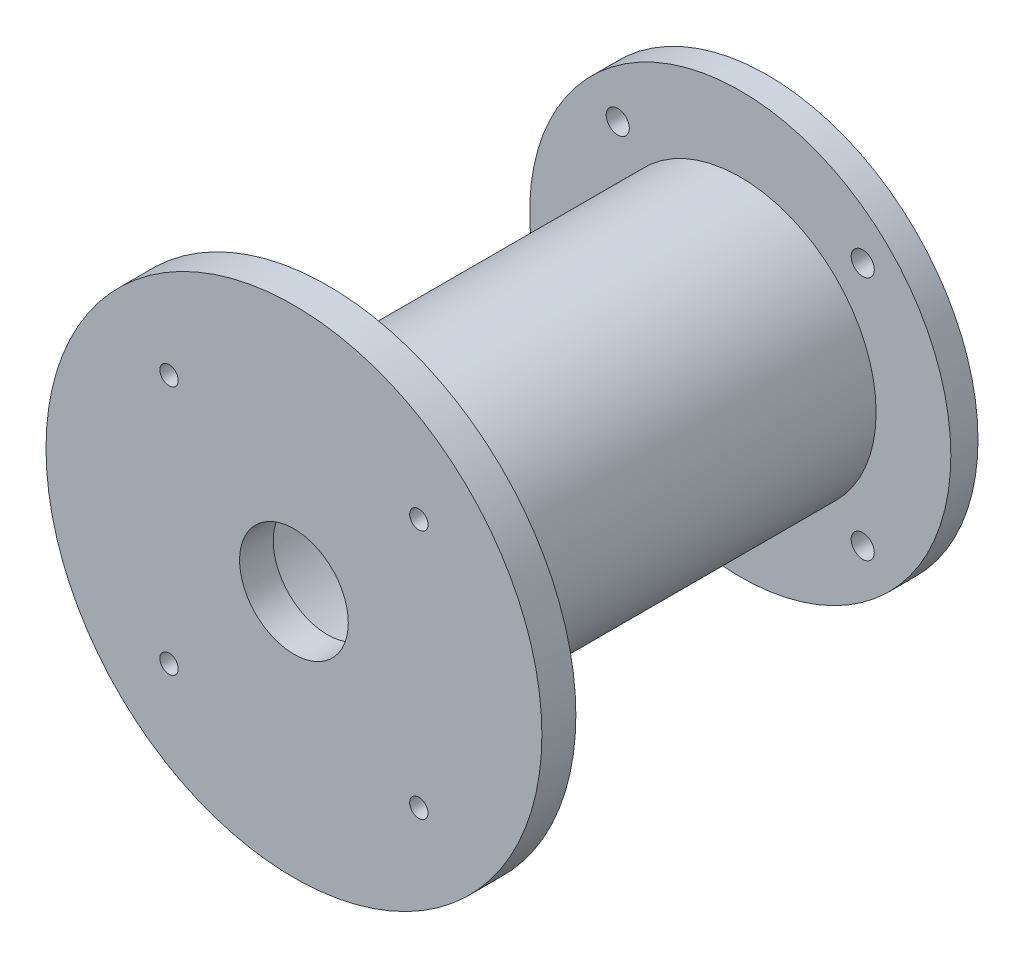
ISO-10303-21;
HEADER;
FILE_DESCRIPTION(('STEP AP214'),'2;1');
FILE_NAME('part.step','',(''),(''),'','','');
FILE_SCHEMA(('AUTOMOTIVE_DESIGN { 1 0 10303 214 1 1 1 1 }'));
ENDSEC;
DATA;
#1=APPLICATION_CONTEXT('core data for automotive mechanical design processes');
#2=APPLICATION_PROTOCOL_DEFINITION('international standard','automotive_design',2000,#1);
#3=PRODUCT_CONTEXT('',#1,'mechanical');
#4=PRODUCT('Part','Part','',(#3));
#5=PRODUCT_RELATED_PRODUCT_CATEGORY('part','',(#4));
#6=PRODUCT_DEFINITION_FORMATION('','',#4);
#7=PRODUCT_DEFINITION_CONTEXT('part definition',#1,'design');
#8=PRODUCT_DEFINITION('design','',#6,#7);
#9=PRODUCT_DEFINITION_SHAPE('','',#8);
#10=(LENGTH_UNIT() NAMED_UNIT(*) SI_UNIT(.MILLI.,.METRE.));
#11=(NAMED_UNIT(*) PLANE_ANGLE_UNIT() SI_UNIT($,.RADIAN.));
#12=(NAMED_UNIT(*) SI_UNIT($,.STERADIAN.) SOLID_ANGLE_UNIT());
#13=UNCERTAINTY_MEASURE_WITH_UNIT(LENGTH_MEASURE(1.E-05),#10,'distance_accuracy_value','');
#14=(GEOMETRIC_REPRESENTATION_CONTEXT(3) GLOBAL_UNCERTAINTY_ASSIGNED_CONTEXT((#13)) GLOBAL_UNIT_ASSIGNED_CONTEXT((#10,
#11,#12)) REPRESENTATION_CONTEXT('',''));
#15=CARTESIAN_POINT('',(0.,0.,0.));
#16=DIRECTION('',(0.,0.,1.));
#17=DIRECTION('',(1.,0.,0.));
#18=AXIS2_PLACEMENT_3D('',#15,#16,#17);
#19=CARTESIAN_POINT('',(120.,0.,131.7));
#20=DIRECTION('',(0.,0.,1.));
#21=DIRECTION('',(1.,0.,0.));
#22=AXIS2_PLACEMENT_3D('',#19,#20,#21);
#23=PLANE('',#22);
#24=CARTESIAN_POINT('',(138.38477631085,18.38477631085,131.7));
#25=DIRECTION('',(0.,0.,1.));
#26=DIRECTION('',(1.,0.,0.));
#27=AXIS2_PLACEMENT_3D('',#24,#25,#26);
#28=CIRCLE('',#27,1.35);
#29=CARTESIAN_POINT('',(139.73477631085,18.38477631085,131.7));
#30=VERTEX_POINT('',#29);
#31=EDGE_CURVE('E279',#30,#30,#28,.T.);
#32=ORIENTED_EDGE('',*,*,#31,.F.);
#33=EDGE_LOOP('',(#32));
#34=FACE_BOUND('',#33,.T.);
#35=CARTESIAN_POINT('',(101.61522368915,18.38477631085,131.7));
#36=DIRECTION('',(0.,0.,1.));
#37=DIRECTION('',(1.,0.,0.));
#38=AXIS2_PLACEMENT_3D('',#35,#36,#37);
#39=CIRCLE('',#38,1.35);
#40=CARTESIAN_POINT('',(102.96522368915,18.38477631085,131.7));
#41=VERTEX_POINT('',#40);
#42=EDGE_CURVE('E316',#41,#41,#39,.T.);
#43=ORIENTED_EDGE('',*,*,#42,.F.);
#44=EDGE_LOOP('',(#43));
#45=FACE_BOUND('',#44,.T.);
#46=CARTESIAN_POINT('',(120.,0.,131.7));
#47=DIRECTION('',(0.,0.,1.));
#48=DIRECTION('',(1.,0.,0.));
#49=AXIS2_PLACEMENT_3D('',#46,#47,#48);
#50=CIRCLE('',#49,8.);
#51=CARTESIAN_POINT('',(128.,0.,131.7));
#52=VERTEX_POINT('',#51);
#53=EDGE_CURVE('E9',#52,#52,#50,.T.);
#54=ORIENTED_EDGE('',*,*,#53,.F.);
#55=EDGE_LOOP('',(#54));
#56=FACE_BOUND('',#55,.T.);
#57=CARTESIAN_POINT('',(138.38477631085,-18.38477631085,131.7));
#58=DIRECTION('',(0.,0.,1.));
#59=DIRECTION('',(1.,0.,0.));
#60=AXIS2_PLACEMENT_3D('',#57,#58,#59);
#61=CIRCLE('',#60,1.35);
#62=CARTESIAN_POINT('',(139.73477631085,-18.38477631085,131.7));
#63=VERTEX_POINT('',#62);
#64=EDGE_CURVE('E211',#63,#63,#61,.T.);
#65=ORIENTED_EDGE('',*,*,#64,.F.);
#66=EDGE_LOOP('',(#65));
#67=FACE_BOUND('',#66,.T.);
#68=CARTESIAN_POINT('',(101.61522368915,-18.38477631085,131.7));
#69=DIRECTION('',(0.,0.,1.));
#70=DIRECTION('',(1.,0.,0.));
#71=AXIS2_PLACEMENT_3D('',#68,#69,#70);
#72=CIRCLE('',#71,1.35);
#73=CARTESIAN_POINT('',(102.96522368915,-18.38477631085,131.7));
#74=VERTEX_POINT('',#73);
#75=EDGE_CURVE('E212',#74,#74,#72,.T.);
#76=ORIENTED_EDGE('',*,*,#75,.F.);
#77=EDGE_LOOP('',(#76));
#78=FACE_BOUND('',#77,.T.);
#79=CARTESIAN_POINT('',(120.,0.,131.7));
#80=DIRECTION('',(0.,0.,1.));
#81=DIRECTION('',(1.,0.,0.));
#82=AXIS2_PLACEMENT_3D('',#79,#80,#81);
#83=CIRCLE('',#82,36.5);
#84=CARTESIAN_POINT('',(156.5,0.,131.7));
#85=VERTEX_POINT('',#84);
#86=EDGE_CURVE('E273',#85,#85,#83,.T.);
#87=ORIENTED_EDGE('',*,*,#86,.T.);
#88=EDGE_LOOP('',(#87));
#89=FACE_BOUND('',#88,.T.);
#90=ADVANCED_FACE('F14',(#34,#45,#56,#67,#78,#89),#23,.T.);
#91=CARTESIAN_POINT('',(120.,0.,126.6));
#92=DIRECTION('',(0.,0.,1.));
#93=DIRECTION('',(1.,0.,0.));
#94=AXIS2_PLACEMENT_3D('',#91,#92,#93);
#95=CYLINDRICAL_SURFACE('',#94,8.);
#96=DIRECTION('',(0.,0.,1.));
#97=VECTOR('',#96,1.);
#98=CARTESIAN_POINT('',(128.,0.,126.6));
#99=LINE('',#98,#97);
#100=CARTESIAN_POINT('',(128.,0.,126.75));
#101=VERTEX_POINT('',#100);
#102=EDGE_CURVE('E25',#101,#52,#99,.T.);
#103=ORIENTED_EDGE('',*,*,#102,.F.);
#104=CARTESIAN_POINT('',(120.,0.,126.75));
#105=DIRECTION('',(0.,0.,1.));
#106=DIRECTION('',(1.,0.,0.));
#107=AXIS2_PLACEMENT_3D('',#104,#105,#106);
#108=CIRCLE('',#107,8.);
#109=EDGE_CURVE('E261',#101,#101,#108,.T.);
#110=ORIENTED_EDGE('',*,*,#109,.F.);
#111=ORIENTED_EDGE('',*,*,#102,.T.);
#112=ORIENTED_EDGE('',*,*,#53,.T.);
#113=EDGE_LOOP('',(#103,#110,#111,#112));
#114=FACE_BOUND('',#113,.T.);
#115=ADVANCED_FACE('F383',(#114),#95,.F.);
#116=CARTESIAN_POINT('',(138.38477631085,18.38477631085,126.6));
#117=DIRECTION('',(0.,0.,1.));
#118=DIRECTION('',(1.,0.,0.));
#119=AXIS2_PLACEMENT_3D('',#116,#117,#118);
#120=CYLINDRICAL_SURFACE('',#119,1.35);
#121=DIRECTION('',(0.,0.,1.));
#122=VECTOR('',#121,1.);
#123=CARTESIAN_POINT('',(139.73477631085,18.38477631085,126.6));
#124=LINE('',#123,#122);
#125=CARTESIAN_POINT('',(139.73477631085,18.38477631085,126.7));
#126=VERTEX_POINT('',#125);
#127=EDGE_CURVE('E312',#126,#30,#124,.T.);
#128=ORIENTED_EDGE('',*,*,#127,.F.);
#129=CARTESIAN_POINT('',(138.38477631085,18.38477631085,126.7));
#130=DIRECTION('',(0.,0.,1.));
#131=DIRECTION('',(1.,0.,0.));
#132=AXIS2_PLACEMENT_3D('',#129,#130,#131);
#133=CIRCLE('',#132,1.35);
#134=EDGE_CURVE('E207',#126,#126,#133,.T.);
#135=ORIENTED_EDGE('',*,*,#134,.F.);
#136=ORIENTED_EDGE('',*,*,#127,.T.);
#137=ORIENTED_EDGE('',*,*,#31,.T.);
#138=EDGE_LOOP('',(#128,#135,#136,#137));
#139=FACE_BOUND('',#138,.T.);
#140=ADVANCED_FACE('F433',(#139),#120,.F.);
#141=CARTESIAN_POINT('',(101.61522368915,18.38477631085,126.6));
#142=DIRECTION('',(0.,0.,1.));
#143=DIRECTION('',(1.,0.,0.));
#144=AXIS2_PLACEMENT_3D('',#141,#142,#143);
#145=CYLINDRICAL_SURFACE('',#144,1.35);
#146=DIRECTION('',(0.,0.,1.));
#147=VECTOR('',#146,1.);
#148=CARTESIAN_POINT('',(102.96522368915,18.38477631085,126.6));
#149=LINE('',#148,#147);
#150=CARTESIAN_POINT('',(102.96522368915,18.38477631085,126.7));
#151=VERTEX_POINT('',#150);
#152=EDGE_CURVE('E103',#151,#41,#149,.T.);
#153=ORIENTED_EDGE('',*,*,#152,.F.);
#154=CARTESIAN_POINT('',(101.61522368915,18.38477631085,126.7));
#155=DIRECTION('',(0.,0.,1.));
#156=DIRECTION('',(1.,0.,0.));
#157=AXIS2_PLACEMENT_3D('',#154,#155,#156);
#158=CIRCLE('',#157,1.35);
#159=EDGE_CURVE('E256',#151,#151,#158,.T.);
#160=ORIENTED_EDGE('',*,*,#159,.F.);
#161=ORIENTED_EDGE('',*,*,#152,.T.);
#162=ORIENTED_EDGE('',*,*,#42,.T.);
#163=EDGE_LOOP('',(#153,#160,#161,#162));
#164=FACE_BOUND('',#163,.T.);
#165=ADVANCED_FACE('F423',(#164),#145,.F.);
#166=CARTESIAN_POINT('',(138.38477631085,-18.38477631085,126.6));
#167=DIRECTION('',(0.,0.,1.));
#168=DIRECTION('',(1.,0.,0.));
#169=AXIS2_PLACEMENT_3D('',#166,#167,#168);
#170=CYLINDRICAL_SURFACE('',#169,1.35);
#171=DIRECTION('',(0.,0.,1.));
#172=VECTOR('',#171,1.);
#173=CARTESIAN_POINT('',(139.73477631085,-18.38477631085,126.6));
#174=LINE('',#173,#172);
#175=CARTESIAN_POINT('',(139.73477631085,-18.38477631085,126.7));
#176=VERTEX_POINT('',#175);
#177=EDGE_CURVE('E114',#176,#63,#174,.T.);
#178=ORIENTED_EDGE('',*,*,#177,.F.);
#179=CARTESIAN_POINT('',(138.38477631085,-18.38477631085,126.7));
#180=DIRECTION('',(0.,0.,1.));
#181=DIRECTION('',(1.,0.,0.));
#182=AXIS2_PLACEMENT_3D('',#179,#180,#181);
#183=CIRCLE('',#182,1.35);
#184=EDGE_CURVE('E297',#176,#176,#183,.T.);
#185=ORIENTED_EDGE('',*,*,#184,.F.);
#186=ORIENTED_EDGE('',*,*,#177,.T.);
#187=ORIENTED_EDGE('',*,*,#64,.T.);
#188=EDGE_LOOP('',(#178,#185,#186,#187));
#189=FACE_BOUND('',#188,.T.);
#190=ADVANCED_FACE('F420',(#189),#170,.F.);
#191=CARTESIAN_POINT('',(101.61522368915,-18.38477631085,126.6));
#192=DIRECTION('',(0.,0.,1.));
#193=DIRECTION('',(1.,0.,0.));
#194=AXIS2_PLACEMENT_3D('',#191,#192,#193);
#195=CYLINDRICAL_SURFACE('',#194,1.35);
#196=DIRECTION('',(0.,0.,1.));
#197=VECTOR('',#196,1.);
#198=CARTESIAN_POINT('',(102.96522368915,-18.38477631085,126.6));
#199=LINE('',#198,#197);
#200=CARTESIAN_POINT('',(102.96522368915,-18.38477631085,126.7));
#201=VERTEX_POINT('',#200);
#202=EDGE_CURVE('E272',#201,#74,#199,.T.);
#203=ORIENTED_EDGE('',*,*,#202,.F.);
#204=CARTESIAN_POINT('',(101.61522368915,-18.38477631085,126.7));
#205=DIRECTION('',(0.,0.,1.));
#206=DIRECTION('',(1.,0.,0.));
#207=AXIS2_PLACEMENT_3D('',#204,#205,#206);
#208=CIRCLE('',#207,1.35);
#209=EDGE_CURVE('E300',#201,#201,#208,.T.);
#210=ORIENTED_EDGE('',*,*,#209,.F.);
#211=ORIENTED_EDGE('',*,*,#202,.T.);
#212=ORIENTED_EDGE('',*,*,#75,.T.);
#213=EDGE_LOOP('',(#203,#210,#211,#212));
#214=FACE_BOUND('',#213,.T.);
#215=ADVANCED_FACE('F378',(#214),#195,.F.);
#216=CARTESIAN_POINT('',(120.,0.,126.7));
#217=DIRECTION('',(0.,0.,1.));
#218=DIRECTION('',(1.,0.,0.));
#219=AXIS2_PLACEMENT_3D('',#216,#217,#218);
#220=CYLINDRICAL_SURFACE('',#219,36.5);
#221=ORIENTED_EDGE('',*,*,#86,.F.);
#222=DIRECTION('',(0.,0.,1.));
#223=VECTOR('',#222,1.);
#224=CARTESIAN_POINT('',(156.5,0.,126.7));
#225=LINE('',#224,#223);
#226=CARTESIAN_POINT('',(156.5,0.,126.7));
#227=VERTEX_POINT('',#226);
#228=EDGE_CURVE('E269',#227,#85,#225,.T.);
#229=ORIENTED_EDGE('',*,*,#228,.F.);
#230=CARTESIAN_POINT('',(120.,0.,126.7));
#231=DIRECTION('',(0.,0.,1.));
#232=DIRECTION('',(1.,0.,0.));
#233=AXIS2_PLACEMENT_3D('',#230,#231,#232);
#234=CIRCLE('',#233,36.5);
#235=EDGE_CURVE('E317',#227,#227,#234,.T.);
#236=ORIENTED_EDGE('',*,*,#235,.T.);
#237=ORIENTED_EDGE('',*,*,#228,.T.);
#238=EDGE_LOOP('',(#221,#229,#236,#237));
#239=FACE_BOUND('',#238,.T.);
#240=ADVANCED_FACE('F388',(#239),#220,.T.);
#241=CARTESIAN_POINT('',(104.,-6.,101.7));
#242=DIRECTION('',(1.,0.,0.));
#243=DIRECTION('',(0.,1.,0.));
#244=AXIS2_PLACEMENT_3D('',#241,#242,#243);
#245=PLANE('',#244);
#246=DIRECTION('',(0.,0.,1.));
#247=VECTOR('',#246,1.);
#248=CARTESIAN_POINT('',(104.,6.,101.7));
#249=LINE('',#248,#247);
#250=CARTESIAN_POINT('',(104.,6.,101.7));
#251=VERTEX_POINT('',#250);
#252=CARTESIAN_POINT('',(104.,6.,126.7));
#253=VERTEX_POINT('',#252);
#254=EDGE_CURVE('E287',#251,#253,#249,.T.);
#255=ORIENTED_EDGE('',*,*,#254,.F.);
#256=DIRECTION('',(0.,1.,0.));
#257=VECTOR('',#256,1.);
#258=CARTESIAN_POINT('',(104.,-6.,101.7));
#259=LINE('',#258,#257);
#260=CARTESIAN_POINT('',(104.,5.744562646538,101.7));
#261=VERTEX_POINT('',#260);
#262=EDGE_CURVE('E262',#261,#251,#259,.T.);
#263=ORIENTED_EDGE('',*,*,#262,.F.);
#264=DIRECTION('',(0.,0.,1.));
#265=VECTOR('',#264,1.);
#266=CARTESIAN_POINT('',(104.,5.744562646538,61.95));
#267=LINE('',#266,#265);
#268=CARTESIAN_POINT('',(104.,5.744562646538,126.7));
#269=VERTEX_POINT('',#268);
#270=EDGE_CURVE('E224',#261,#269,#267,.T.);
#271=ORIENTED_EDGE('',*,*,#270,.T.);
#272=DIRECTION('',(0.,1.,0.));
#273=VECTOR('',#272,1.);
#274=CARTESIAN_POINT('',(104.,-6.,126.7));
#275=LINE('',#274,#273);
#276=EDGE_CURVE('E229',#269,#253,#275,.T.);
#277=ORIENTED_EDGE('',*,*,#276,.T.);
#278=EDGE_LOOP('',(#255,#263,#271,#277));
#279=FACE_BOUND('',#278,.T.);
#280=ADVANCED_FACE('F413',(#279),#245,.F.);
#281=CARTESIAN_POINT('',(104.,-6.,101.7));
#282=DIRECTION('',(1.,0.,0.));
#283=DIRECTION('',(0.,1.,0.));
#284=AXIS2_PLACEMENT_3D('',#281,#282,#283);
#285=PLANE('',#284);
#286=DIRECTION('',(0.,0.,1.));
#287=VECTOR('',#286,1.);
#288=CARTESIAN_POINT('',(104.,-5.744562646538,61.95));
#289=LINE('',#288,#287);
#290=CARTESIAN_POINT('',(104.,-5.744562646538,101.7));
#291=VERTEX_POINT('',#290);
#292=CARTESIAN_POINT('',(104.,-5.744562646538,126.7));
#293=VERTEX_POINT('',#292);
#294=EDGE_CURVE('E223',#291,#293,#289,.T.);
#295=ORIENTED_EDGE('',*,*,#294,.F.);
#296=DIRECTION('',(0.,1.,0.));
#297=VECTOR('',#296,1.);
#298=CARTESIAN_POINT('',(104.,-6.,101.7));
#299=LINE('',#298,#297);
#300=CARTESIAN_POINT('',(104.,-6.,101.7));
#301=VERTEX_POINT('',#300);
#302=EDGE_CURVE('E217',#301,#291,#299,.T.);
#303=ORIENTED_EDGE('',*,*,#302,.F.);
#304=DIRECTION('',(0.,0.,1.));
#305=VECTOR('',#304,1.);
#306=CARTESIAN_POINT('',(104.,-6.,101.7));
#307=LINE('',#306,#305);
#308=CARTESIAN_POINT('',(104.,-6.,126.7));
#309=VERTEX_POINT('',#308);
#310=EDGE_CURVE('E257',#301,#309,#307,.T.);
#311=ORIENTED_EDGE('',*,*,#310,.T.);
#312=DIRECTION('',(0.,1.,0.));
#313=VECTOR('',#312,1.);
#314=CARTESIAN_POINT('',(104.,-6.,126.7));
#315=LINE('',#314,#313);
#316=EDGE_CURVE('E208',#309,#293,#315,.T.);
#317=ORIENTED_EDGE('',*,*,#316,.T.);
#318=EDGE_LOOP('',(#295,#303,#311,#317));
#319=FACE_BOUND('',#318,.T.);
#320=ADVANCED_FACE('F16',(#319),#285,.F.);
#321=CARTESIAN_POINT('',(120.,0.,126.75));
#322=DIRECTION('',(0.,0.,1.));
#323=DIRECTION('',(1.,0.,0.));
#324=AXIS2_PLACEMENT_3D('',#321,#322,#323);
#325=PLANE('',#324);
#326=ORIENTED_EDGE('',*,*,#109,.T.);
#327=EDGE_LOOP('',(#326));
#328=FACE_BOUND('',#327,.T.);
#329=CARTESIAN_POINT('',(120.,0.,126.75));
#330=DIRECTION('',(0.,0.,1.));
#331=DIRECTION('',(1.,0.,0.));
#332=AXIS2_PLACEMENT_3D('',#329,#330,#331);
#333=CIRCLE('',#332,17.);
#334=CARTESIAN_POINT('',(137.,0.,126.75));
#335=VERTEX_POINT('',#334);
#336=EDGE_CURVE('E194',#335,#335,#333,.T.);
#337=ORIENTED_EDGE('',*,*,#336,.F.);
#338=EDGE_LOOP('',(#337));
#339=FACE_BOUND('',#338,.T.);
#340=ADVANCED_FACE('F428',(#328,#339),#325,.F.);
#341=CARTESIAN_POINT('',(99.,-6.,101.7));
#342=DIRECTION('',(0.,1.,0.));
#343=DIRECTION('',(1.,0.,0.));
#344=AXIS2_PLACEMENT_3D('',#341,#342,#343);
#345=PLANE('',#344);
#346=DIRECTION('',(1.,0.,0.));
#347=VECTOR('',#346,1.);
#348=CARTESIAN_POINT('',(99.,-6.,101.7));
#349=LINE('',#348,#347);
#350=CARTESIAN_POINT('',(100.92121597166,-6.,101.7));
#351=VERTEX_POINT('',#350);
#352=EDGE_CURVE('E213',#351,#301,#349,.T.);
#353=ORIENTED_EDGE('',*,*,#352,.F.);
#354=DIRECTION('',(0.,0.,1.));
#355=VECTOR('',#354,1.);
#356=CARTESIAN_POINT('',(100.92121597166,-6.,62.));
#357=LINE('',#356,#355);
#358=CARTESIAN_POINT('',(100.92121597166,-6.,126.7));
#359=VERTEX_POINT('',#358);
#360=EDGE_CURVE('E202',#351,#359,#357,.T.);
#361=ORIENTED_EDGE('',*,*,#360,.T.);
#362=DIRECTION('',(1.,0.,0.));
#363=VECTOR('',#362,1.);
#364=CARTESIAN_POINT('',(99.,-6.,126.7));
#365=LINE('',#364,#363);
#366=EDGE_CURVE('E204',#359,#309,#365,.T.);
#367=ORIENTED_EDGE('',*,*,#366,.T.);
#368=ORIENTED_EDGE('',*,*,#310,.F.);
#369=EDGE_LOOP('',(#353,#361,#367,#368));
#370=FACE_BOUND('',#369,.T.);
#371=ADVANCED_FACE('F426',(#370),#345,.T.);
#372=CARTESIAN_POINT('',(99.,-6.,101.7));
#373=DIRECTION('',(0.,0.,1.));
#374=DIRECTION('',(1.,0.,0.));
#375=AXIS2_PLACEMENT_3D('',#372,#373,#374);
#376=PLANE('',#375);
#377=DIRECTION('',(1.,0.,0.));
#378=VECTOR('',#377,1.);
#379=CARTESIAN_POINT('',(99.,6.,101.7));
#380=LINE('',#379,#378);
#381=CARTESIAN_POINT('',(100.92121597166,6.,101.7));
#382=VERTEX_POINT('',#381);
#383=EDGE_CURVE('E218',#382,#251,#380,.T.);
#384=ORIENTED_EDGE('',*,*,#383,.F.);
#385=CARTESIAN_POINT('',(120.,0.,101.7));
#386=DIRECTION('',(0.,0.,1.));
#387=DIRECTION('',(1.,0.,0.));
#388=AXIS2_PLACEMENT_3D('',#385,#386,#387);
#389=CIRCLE('',#388,20.);
#390=EDGE_CURVE('E243',#382,#351,#389,.T.);
#391=ORIENTED_EDGE('',*,*,#390,.T.);
#392=ORIENTED_EDGE('',*,*,#352,.T.);
#393=ORIENTED_EDGE('',*,*,#302,.T.);
#394=CARTESIAN_POINT('',(120.,0.,101.7));
#395=DIRECTION('',(0.,0.,1.));
#396=DIRECTION('',(1.,0.,0.));
#397=AXIS2_PLACEMENT_3D('',#394,#395,#396);
#398=CIRCLE('',#397,17.);
#399=EDGE_CURVE('E219',#261,#291,#398,.T.);
#400=ORIENTED_EDGE('',*,*,#399,.F.);
#401=ORIENTED_EDGE('',*,*,#262,.T.);
#402=EDGE_LOOP('',(#384,#391,#392,#393,#400,#401));
#403=FACE_BOUND('',#402,.T.);
#404=ADVANCED_FACE('F404',(#403),#376,.T.);
#405=CARTESIAN_POINT('',(99.,6.,101.7));
#406=DIRECTION('',(0.,1.,0.));
#407=DIRECTION('',(1.,0.,0.));
#408=AXIS2_PLACEMENT_3D('',#405,#406,#407);
#409=PLANE('',#408);
#410=ORIENTED_EDGE('',*,*,#254,.T.);
#411=DIRECTION('',(1.,0.,0.));
#412=VECTOR('',#411,1.);
#413=CARTESIAN_POINT('',(99.,6.,126.7));
#414=LINE('',#413,#412);
#415=CARTESIAN_POINT('',(100.92121597166,6.,126.7));
#416=VERTEX_POINT('',#415);
#417=EDGE_CURVE('E233',#416,#253,#414,.T.);
#418=ORIENTED_EDGE('',*,*,#417,.F.);
#419=DIRECTION('',(0.,0.,1.));
#420=VECTOR('',#419,1.);
#421=CARTESIAN_POINT('',(100.92121597166,6.,62.));
#422=LINE('',#421,#420);
#423=EDGE_CURVE('E198',#382,#416,#422,.T.);
#424=ORIENTED_EDGE('',*,*,#423,.F.);
#425=ORIENTED_EDGE('',*,*,#383,.T.);
#426=EDGE_LOOP('',(#410,#418,#424,#425));
#427=FACE_BOUND('',#426,.T.);
#428=ADVANCED_FACE('F394',(#427),#409,.F.);
#429=CARTESIAN_POINT('',(120.,0.,126.7));
#430=DIRECTION('',(0.,0.,1.));
#431=DIRECTION('',(1.,0.,0.));
#432=AXIS2_PLACEMENT_3D('',#429,#430,#431);
#433=PLANE('',#432);
#434=ORIENTED_EDGE('',*,*,#134,.T.);
#435=EDGE_LOOP('',(#434));
#436=FACE_BOUND('',#435,.T.);
#437=ORIENTED_EDGE('',*,*,#417,.T.);
#438=ORIENTED_EDGE('',*,*,#276,.F.);
#439=CARTESIAN_POINT('',(120.,0.,126.7));
#440=DIRECTION('',(0.,0.,1.));
#441=DIRECTION('',(1.,0.,0.));
#442=AXIS2_PLACEMENT_3D('',#439,#440,#441);
#443=CIRCLE('',#442,17.);
#444=EDGE_CURVE('E228',#269,#293,#443,.T.);
#445=ORIENTED_EDGE('',*,*,#444,.T.);
#446=ORIENTED_EDGE('',*,*,#316,.F.);
#447=ORIENTED_EDGE('',*,*,#366,.F.);
#448=CARTESIAN_POINT('',(120.,0.,126.7));
#449=DIRECTION('',(0.,0.,1.));
#450=DIRECTION('',(1.,0.,0.));
#451=AXIS2_PLACEMENT_3D('',#448,#449,#450);
#452=CIRCLE('',#451,20.);
#453=CARTESIAN_POINT('',(140.,0.,126.7));
#454=VERTEX_POINT('',#453);
#455=EDGE_CURVE('E234',#359,#454,#452,.T.);
#456=ORIENTED_EDGE('',*,*,#455,.T.);
#457=CARTESIAN_POINT('',(120.,0.,126.7));
#458=DIRECTION('',(0.,0.,1.));
#459=DIRECTION('',(1.,0.,0.));
#460=AXIS2_PLACEMENT_3D('',#457,#458,#459);
#461=CIRCLE('',#460,20.);
#462=EDGE_CURVE('E187',#454,#416,#461,.T.);
#463=ORIENTED_EDGE('',*,*,#462,.T.);
#464=EDGE_LOOP('',(#437,#438,#445,#446,#447,#456,#463));
#465=FACE_BOUND('',#464,.T.);
#466=ORIENTED_EDGE('',*,*,#159,.T.);
#467=EDGE_LOOP('',(#466));
#468=FACE_BOUND('',#467,.T.);
#469=ORIENTED_EDGE('',*,*,#184,.T.);
#470=EDGE_LOOP('',(#469));
#471=FACE_BOUND('',#470,.T.);
#472=ORIENTED_EDGE('',*,*,#209,.T.);
#473=EDGE_LOOP('',(#472));
#474=FACE_BOUND('',#473,.T.);
#475=ORIENTED_EDGE('',*,*,#235,.F.);
#476=EDGE_LOOP('',(#475));
#477=FACE_BOUND('',#476,.T.);
#478=ADVANCED_FACE('F391',(#436,#465,#468,#471,#474,#477),#433,.F.);
#479=CARTESIAN_POINT('',(120.,0.,61.95));
#480=DIRECTION('',(0.,0.,1.));
#481=DIRECTION('',(1.,0.,0.));
#482=AXIS2_PLACEMENT_3D('',#479,#480,#481);
#483=CYLINDRICAL_SURFACE('',#482,17.);
#484=ORIENTED_EDGE('',*,*,#444,.F.);
#485=ORIENTED_EDGE('',*,*,#270,.F.);
#486=ORIENTED_EDGE('',*,*,#399,.T.);
#487=ORIENTED_EDGE('',*,*,#294,.T.);
#488=EDGE_LOOP('',(#484,#485,#486,#487));
#489=FACE_BOUND('',#488,.T.);
#490=DIRECTION('',(0.,0.,1.));
#491=VECTOR('',#490,1.);
#492=CARTESIAN_POINT('',(137.,0.,61.95));
#493=LINE('',#492,#491);
#494=CARTESIAN_POINT('',(137.,0.,62.));
#495=VERTEX_POINT('',#494);
#496=EDGE_CURVE('E186',#495,#335,#493,.T.);
#497=ORIENTED_EDGE('',*,*,#496,.T.);
#498=ORIENTED_EDGE('',*,*,#336,.T.);
#499=ORIENTED_EDGE('',*,*,#496,.F.);
#500=CARTESIAN_POINT('',(120.,0.,62.));
#501=DIRECTION('',(0.,0.,1.));
#502=DIRECTION('',(1.,0.,0.));
#503=AXIS2_PLACEMENT_3D('',#500,#501,#502);
#504=CIRCLE('',#503,17.);
#505=EDGE_CURVE('E242',#495,#495,#504,.T.);
#506=ORIENTED_EDGE('',*,*,#505,.F.);
#507=EDGE_LOOP('',(#497,#498,#499,#506));
#508=FACE_BOUND('',#507,.T.);
#509=ADVANCED_FACE('F393',(#489,#508),#483,.F.);
#510=CARTESIAN_POINT('',(138.03122292025,18.031222920257,61.9));
#511=DIRECTION('',(0.,0.,1.));
#512=DIRECTION('',(1.,0.,0.));
#513=AXIS2_PLACEMENT_3D('',#510,#511,#512);
#514=CYLINDRICAL_SURFACE('',#513,1.7);
#515=DIRECTION('',(0.,0.,1.));
#516=VECTOR('',#515,1.);
#517=CARTESIAN_POINT('',(139.73122292025,18.031222920257,61.9));
#518=LINE('',#517,#516);
#519=CARTESIAN_POINT('',(139.73122292025,18.031222920257,62.));
#520=VERTEX_POINT('',#519);
#521=CARTESIAN_POINT('',(139.73122292025,18.031222920257,66.));
#522=VERTEX_POINT('',#521);
#523=EDGE_CURVE('E179',#520,#522,#518,.T.);
#524=ORIENTED_EDGE('',*,*,#523,.F.);
#525=CARTESIAN_POINT('',(138.03122292025,18.031222920257,62.));
#526=DIRECTION('',(0.,0.,1.));
#527=DIRECTION('',(1.,0.,0.));
#528=AXIS2_PLACEMENT_3D('',#525,#526,#527);
#529=CIRCLE('',#528,1.7);
#530=EDGE_CURVE('E184',#520,#520,#529,.T.);
#531=ORIENTED_EDGE('',*,*,#530,.F.);
#532=ORIENTED_EDGE('',*,*,#523,.T.);
#533=CARTESIAN_POINT('',(138.03122292025,18.031222920257,66.));
#534=DIRECTION('',(0.,0.,1.));
#535=DIRECTION('',(1.,0.,0.));
#536=AXIS2_PLACEMENT_3D('',#533,#534,#535);
#537=CIRCLE('',#536,1.7);
#538=EDGE_CURVE('E182',#522,#522,#537,.T.);
#539=ORIENTED_EDGE('',*,*,#538,.T.);
#540=EDGE_LOOP('',(#524,#531,#532,#539));
#541=FACE_BOUND('',#540,.T.);
#542=ADVANCED_FACE('F180',(#541),#514,.F.);
#543=CARTESIAN_POINT('',(120.,0.,62.));
#544=DIRECTION('',(0.,0.,1.));
#545=DIRECTION('',(1.,0.,0.));
#546=AXIS2_PLACEMENT_3D('',#543,#544,#545);
#547=CYLINDRICAL_SURFACE('',#546,20.);
#548=DIRECTION('',(0.,0.,1.));
#549=VECTOR('',#548,1.);
#550=CARTESIAN_POINT('',(140.,0.,62.));
#551=LINE('',#550,#549);
#552=CARTESIAN_POINT('',(140.,0.,66.));
#553=VERTEX_POINT('',#552);
#554=EDGE_CURVE('E238',#553,#454,#551,.T.);
#555=ORIENTED_EDGE('',*,*,#554,.F.);
#556=CARTESIAN_POINT('',(120.,0.,66.));
#557=DIRECTION('',(0.,0.,1.));
#558=DIRECTION('',(1.,0.,0.));
#559=AXIS2_PLACEMENT_3D('',#556,#557,#558);
#560=CIRCLE('',#559,20.);
#561=EDGE_CURVE('E293',#553,#553,#560,.T.);
#562=ORIENTED_EDGE('',*,*,#561,.T.);
#563=ORIENTED_EDGE('',*,*,#554,.T.);
#564=ORIENTED_EDGE('',*,*,#455,.F.);
#565=ORIENTED_EDGE('',*,*,#360,.F.);
#566=ORIENTED_EDGE('',*,*,#390,.F.);
#567=ORIENTED_EDGE('',*,*,#423,.T.);
#568=ORIENTED_EDGE('',*,*,#462,.F.);
#569=EDGE_LOOP('',(#555,#562,#563,#564,#565,#566,#567,#568));
#570=FACE_BOUND('',#569,.T.);
#571=ADVANCED_FACE('F509',(#570),#547,.T.);
#572=CARTESIAN_POINT('',(101.96877707974,18.031222920257,61.9));
#573=DIRECTION('',(0.,0.,1.));
#574=DIRECTION('',(1.,0.,0.));
#575=AXIS2_PLACEMENT_3D('',#572,#573,#574);
#576=CYLINDRICAL_SURFACE('',#575,1.7);
#577=DIRECTION('',(0.,0.,1.));
#578=VECTOR('',#577,1.);
#579=CARTESIAN_POINT('',(103.66877707974,18.031222920257,61.9));
#580=LINE('',#579,#578);
#581=CARTESIAN_POINT('',(103.66877707974,18.031222920257,62.));
#582=VERTEX_POINT('',#581);
#583=CARTESIAN_POINT('',(103.66877707974,18.031222920257,66.));
#584=VERTEX_POINT('',#583);
#585=EDGE_CURVE('E327',#582,#584,#580,.T.);
#586=ORIENTED_EDGE('',*,*,#585,.F.);
#587=CARTESIAN_POINT('',(101.96877707974,18.031222920257,62.));
#588=DIRECTION('',(0.,0.,1.));
#589=DIRECTION('',(1.,0.,0.));
#590=AXIS2_PLACEMENT_3D('',#587,#588,#589);
#591=CIRCLE('',#590,1.7);
#592=EDGE_CURVE('E251',#582,#582,#591,.T.);
#593=ORIENTED_EDGE('',*,*,#592,.F.);
#594=ORIENTED_EDGE('',*,*,#585,.T.);
#595=CARTESIAN_POINT('',(101.96877707974,18.031222920257,66.));
#596=DIRECTION('',(0.,0.,1.));
#597=DIRECTION('',(1.,0.,0.));
#598=AXIS2_PLACEMENT_3D('',#595,#596,#597);
#599=CIRCLE('',#598,1.7);
#600=EDGE_CURVE('E267',#584,#584,#599,.T.);
#601=ORIENTED_EDGE('',*,*,#600,.T.);
#602=EDGE_LOOP('',(#586,#593,#594,#601));
#603=FACE_BOUND('',#602,.T.);
#604=ADVANCED_FACE('F418',(#603),#576,.F.);
#605=CARTESIAN_POINT('',(138.03122292025,-18.03122292025,61.9));
#606=DIRECTION('',(0.,0.,1.));
#607=DIRECTION('',(1.,0.,0.));
#608=AXIS2_PLACEMENT_3D('',#605,#606,#607);
#609=CYLINDRICAL_SURFACE('',#608,1.7);
#610=DIRECTION('',(0.,0.,1.));
#611=VECTOR('',#610,1.);
#612=CARTESIAN_POINT('',(139.73122292025,-18.03122292025,61.9));
#613=LINE('',#612,#611);
#614=CARTESIAN_POINT('',(139.73122292025,-18.03122292025,62.));
#615=VERTEX_POINT('',#614);
#616=CARTESIAN_POINT('',(139.73122292025,-18.03122292025,66.));
#617=VERTEX_POINT('',#616);
#618=EDGE_CURVE('E323',#615,#617,#613,.T.);
#619=ORIENTED_EDGE('',*,*,#618,.F.);
#620=CARTESIAN_POINT('',(138.03122292025,-18.03122292025,62.));
#621=DIRECTION('',(0.,0.,1.));
#622=DIRECTION('',(1.,0.,0.));
#623=AXIS2_PLACEMENT_3D('',#620,#621,#622);
#624=CIRCLE('',#623,1.7);
#625=EDGE_CURVE('E247',#615,#615,#624,.T.);
#626=ORIENTED_EDGE('',*,*,#625,.F.);
#627=ORIENTED_EDGE('',*,*,#618,.T.);
#628=CARTESIAN_POINT('',(138.03122292025,-18.03122292025,66.));
#629=DIRECTION('',(0.,0.,1.));
#630=DIRECTION('',(1.,0.,0.));
#631=AXIS2_PLACEMENT_3D('',#628,#629,#630);
#632=CIRCLE('',#631,1.7);
#633=EDGE_CURVE('E263',#617,#617,#632,.T.);
#634=ORIENTED_EDGE('',*,*,#633,.T.);
#635=EDGE_LOOP('',(#619,#626,#627,#634));
#636=FACE_BOUND('',#635,.T.);
#637=ADVANCED_FACE('F414',(#636),#609,.F.);
#638=CARTESIAN_POINT('',(101.96877707974,-18.03122292025,61.9));
#639=DIRECTION('',(0.,0.,1.));
#640=DIRECTION('',(1.,0.,0.));
#641=AXIS2_PLACEMENT_3D('',#638,#639,#640);
#642=CYLINDRICAL_SURFACE('',#641,1.7);
#643=DIRECTION('',(0.,0.,1.));
#644=VECTOR('',#643,1.);
#645=CARTESIAN_POINT('',(103.66877707974,-18.03122292025,61.9));
#646=LINE('',#645,#644);
#647=CARTESIAN_POINT('',(103.66877707974,-18.03122292025,62.));
#648=VERTEX_POINT('',#647);
#649=CARTESIAN_POINT('',(103.66877707974,-18.03122292025,66.));
#650=VERTEX_POINT('',#649);
#651=EDGE_CURVE('E241',#648,#650,#646,.T.);
#652=ORIENTED_EDGE('',*,*,#651,.F.);
#653=CARTESIAN_POINT('',(101.96877707974,-18.03122292025,62.));
#654=DIRECTION('',(0.,0.,1.));
#655=DIRECTION('',(1.,0.,0.));
#656=AXIS2_PLACEMENT_3D('',#653,#654,#655);
#657=CIRCLE('',#656,1.7);
#658=EDGE_CURVE('E252',#648,#648,#657,.T.);
#659=ORIENTED_EDGE('',*,*,#658,.F.);
#660=ORIENTED_EDGE('',*,*,#651,.T.);
#661=CARTESIAN_POINT('',(101.96877707974,-18.03122292025,66.));
#662=DIRECTION('',(0.,0.,1.));
#663=DIRECTION('',(1.,0.,0.));
#664=AXIS2_PLACEMENT_3D('',#661,#662,#663);
#665=CIRCLE('',#664,1.7);
#666=EDGE_CURVE('E268',#650,#650,#665,.T.);
#667=ORIENTED_EDGE('',*,*,#666,.T.);
#668=EDGE_LOOP('',(#652,#659,#660,#667));
#669=FACE_BOUND('',#668,.T.);
#670=ADVANCED_FACE('F417',(#669),#642,.F.);
#671=CARTESIAN_POINT('',(120.,0.,62.));
#672=DIRECTION('',(0.,0.,1.));
#673=DIRECTION('',(1.,0.,0.));
#674=AXIS2_PLACEMENT_3D('',#671,#672,#673);
#675=PLANE('',#674);
#676=ORIENTED_EDGE('',*,*,#530,.T.);
#677=EDGE_LOOP('',(#676));
#678=FACE_BOUND('',#677,.T.);
#679=ORIENTED_EDGE('',*,*,#505,.T.);
#680=EDGE_LOOP('',(#679));
#681=FACE_BOUND('',#680,.T.);
#682=ORIENTED_EDGE('',*,*,#592,.T.);
#683=EDGE_LOOP('',(#682));
#684=FACE_BOUND('',#683,.T.);
#685=ORIENTED_EDGE('',*,*,#625,.T.);
#686=EDGE_LOOP('',(#685));
#687=FACE_BOUND('',#686,.T.);
#688=ORIENTED_EDGE('',*,*,#658,.T.);
#689=EDGE_LOOP('',(#688));
#690=FACE_BOUND('',#689,.T.);
#691=CARTESIAN_POINT('',(120.,0.,62.));
#692=DIRECTION('',(0.,0.,1.));
#693=DIRECTION('',(1.,0.,0.));
#694=AXIS2_PLACEMENT_3D('',#691,#692,#693);
#695=CIRCLE('',#694,31.);
#696=CARTESIAN_POINT('',(151.,0.,62.));
#697=VERTEX_POINT('',#696);
#698=EDGE_CURVE('E283',#697,#697,#695,.T.);
#699=ORIENTED_EDGE('',*,*,#698,.F.);
#700=EDGE_LOOP('',(#699));
#701=FACE_BOUND('',#700,.T.);
#702=ADVANCED_FACE('F457',(#678,#681,#684,#687,#690,#701),#675,.F.);
#703=CARTESIAN_POINT('',(120.,0.,66.));
#704=DIRECTION('',(0.,0.,1.));
#705=DIRECTION('',(1.,0.,0.));
#706=AXIS2_PLACEMENT_3D('',#703,#704,#705);
#707=PLANE('',#706);
#708=ORIENTED_EDGE('',*,*,#538,.F.);
#709=EDGE_LOOP('',(#708));
#710=FACE_BOUND('',#709,.T.);
#711=ORIENTED_EDGE('',*,*,#561,.F.);
#712=EDGE_LOOP('',(#711));
#713=FACE_BOUND('',#712,.T.);
#714=ORIENTED_EDGE('',*,*,#600,.F.);
#715=EDGE_LOOP('',(#714));
#716=FACE_BOUND('',#715,.T.);
#717=ORIENTED_EDGE('',*,*,#633,.F.);
#718=EDGE_LOOP('',(#717));
#719=FACE_BOUND('',#718,.T.);
#720=ORIENTED_EDGE('',*,*,#666,.F.);
#721=EDGE_LOOP('',(#720));
#722=FACE_BOUND('',#721,.T.);
#723=CARTESIAN_POINT('',(120.,0.,66.));
#724=DIRECTION('',(0.,0.,1.));
#725=DIRECTION('',(1.,0.,0.));
#726=AXIS2_PLACEMENT_3D('',#723,#724,#725);
#727=CIRCLE('',#726,31.);
#728=CARTESIAN_POINT('',(151.,0.,66.));
#729=VERTEX_POINT('',#728);
#730=EDGE_CURVE('E308',#729,#729,#727,.T.);
#731=ORIENTED_EDGE('',*,*,#730,.T.);
#732=EDGE_LOOP('',(#731));
#733=FACE_BOUND('',#732,.T.);
#734=ADVANCED_FACE('F460',(#710,#713,#716,#719,#722,#733),#707,.T.);
#735=CARTESIAN_POINT('',(120.,0.,62.));
#736=DIRECTION('',(0.,0.,1.));
#737=DIRECTION('',(1.,0.,0.));
#738=AXIS2_PLACEMENT_3D('',#735,#736,#737);
#739=CYLINDRICAL_SURFACE('',#738,31.);
#740=ORIENTED_EDGE('',*,*,#730,.F.);
#741=DIRECTION('',(0.,0.,1.));
#742=VECTOR('',#741,1.);
#743=CARTESIAN_POINT('',(151.,0.,62.));
#744=LINE('',#743,#742);
#745=EDGE_CURVE('E18',#697,#729,#744,.T.);
#746=ORIENTED_EDGE('',*,*,#745,.F.);
#747=ORIENTED_EDGE('',*,*,#698,.T.);
#748=ORIENTED_EDGE('',*,*,#745,.T.);
#749=EDGE_LOOP('',(#740,#746,#747,#748));
#750=FACE_BOUND('',#749,.T.);
#751=ADVANCED_FACE('F473',(#750),#739,.T.);
#752=CLOSED_SHELL('',(#90,#115,#140,#165,#190,#215,#240,#280,#320,#340,#371,#404,#428,#478,#509,
#542,#571,#604,#637,#670,#702,#734,#751));
#753=MANIFOLD_SOLID_BREP('B1',#752);
#754=ADVANCED_BREP_SHAPE_REPRESENTATION('',(#18,#753),#14);
#755=SHAPE_DEFINITION_REPRESENTATION(#9,#754);
ENDSEC;
END-ISO-10303-21;
